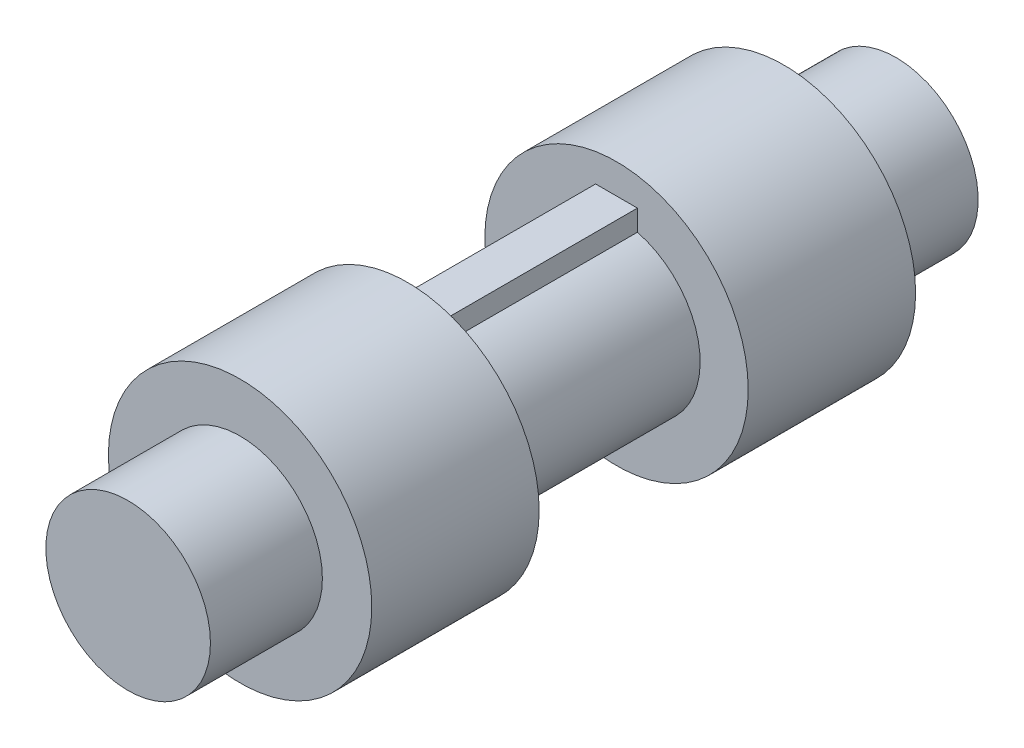
ISO-10303-21;
HEADER;
FILE_DESCRIPTION(('STEP AP214'),'2;1');
FILE_NAME('part.step','',(''),(''),'','','');
FILE_SCHEMA(('AUTOMOTIVE_DESIGN { 1 0 10303 214 1 1 1 1 }'));
ENDSEC;
DATA;
#1=APPLICATION_CONTEXT('core data for automotive mechanical design processes');
#2=APPLICATION_PROTOCOL_DEFINITION('international standard','automotive_design',2000,#1);
#3=PRODUCT_CONTEXT('',#1,'mechanical');
#4=PRODUCT('Part','Part','',(#3));
#5=PRODUCT_RELATED_PRODUCT_CATEGORY('part','',(#4));
#6=PRODUCT_DEFINITION_FORMATION('','',#4);
#7=PRODUCT_DEFINITION_CONTEXT('part definition',#1,'design');
#8=PRODUCT_DEFINITION('design','',#6,#7);
#9=PRODUCT_DEFINITION_SHAPE('','',#8);
#10=(LENGTH_UNIT() NAMED_UNIT(*) SI_UNIT(.MILLI.,.METRE.));
#11=(NAMED_UNIT(*) PLANE_ANGLE_UNIT() SI_UNIT($,.RADIAN.));
#12=(NAMED_UNIT(*) SI_UNIT($,.STERADIAN.) SOLID_ANGLE_UNIT());
#13=UNCERTAINTY_MEASURE_WITH_UNIT(LENGTH_MEASURE(1.E-05),#10,'distance_accuracy_value','');
#14=(GEOMETRIC_REPRESENTATION_CONTEXT(3) GLOBAL_UNCERTAINTY_ASSIGNED_CONTEXT((#13)) GLOBAL_UNIT_ASSIGNED_CONTEXT((#10,
#11,#12)) REPRESENTATION_CONTEXT('',''));
#15=CARTESIAN_POINT('',(0.,0.,0.));
#16=DIRECTION('',(0.,0.,1.));
#17=DIRECTION('',(1.,0.,0.));
#18=AXIS2_PLACEMENT_3D('',#15,#16,#17);
#19=CARTESIAN_POINT('',(0.,0.,-17.));
#20=DIRECTION('',(0.,0.,1.));
#21=DIRECTION('',(1.,0.,0.));
#22=AXIS2_PLACEMENT_3D('',#19,#20,#21);
#23=CYLINDRICAL_SURFACE('',#22,12.5);
#24=CARTESIAN_POINT('',(0.,0.,-17.));
#25=DIRECTION('',(0.,0.,1.));
#26=DIRECTION('',(1.,0.,0.));
#27=AXIS2_PLACEMENT_3D('',#24,#25,#26);
#28=CIRCLE('',#27,12.5);
#29=CARTESIAN_POINT('',(12.5,0.,-17.));
#30=VERTEX_POINT('',#29);
#31=EDGE_CURVE('E116',#30,#30,#28,.T.);
#32=ORIENTED_EDGE('',*,*,#31,.T.);
#33=EDGE_LOOP('',(#32));
#34=FACE_BOUND('',#33,.T.);
#35=CARTESIAN_POINT('',(0.,0.,0.));
#36=DIRECTION('',(0.,0.,1.));
#37=DIRECTION('',(1.,0.,0.));
#38=AXIS2_PLACEMENT_3D('',#35,#36,#37);
#39=CIRCLE('',#38,12.5);
#40=CARTESIAN_POINT('',(12.5,0.,0.));
#41=VERTEX_POINT('',#40);
#42=EDGE_CURVE('E36',#41,#41,#39,.T.);
#43=ORIENTED_EDGE('',*,*,#42,.F.);
#44=EDGE_LOOP('',(#43));
#45=FACE_BOUND('',#44,.T.);
#46=ADVANCED_FACE('F33',(#34,#45),#23,.T.);
#47=CARTESIAN_POINT('',(0.,0.,0.));
#48=DIRECTION('',(0.,0.,1.));
#49=DIRECTION('',(1.,0.,0.));
#50=AXIS2_PLACEMENT_3D('',#47,#48,#49);
#51=PLANE('',#50);
#52=ORIENTED_EDGE('',*,*,#42,.T.);
#53=EDGE_LOOP('',(#52));
#54=FACE_BOUND('',#53,.T.);
#55=ADVANCED_FACE('F124',(#54),#51,.T.);
#56=CARTESIAN_POINT('',(0.,0.,-42.425));
#57=DIRECTION('',(0.,0.,1.));
#58=DIRECTION('',(1.,0.,0.));
#59=AXIS2_PLACEMENT_3D('',#56,#57,#58);
#60=CYLINDRICAL_SURFACE('',#59,20.);
#61=CARTESIAN_POINT('',(0.,0.,-42.425));
#62=DIRECTION('',(0.,0.,-1.));
#63=DIRECTION('',(-1.,0.,0.));
#64=AXIS2_PLACEMENT_3D('',#61,#62,#63);
#65=CIRCLE('',#64,20.);
#66=CARTESIAN_POINT('',(20.,0.,-42.425));
#67=VERTEX_POINT('',#66);
#68=EDGE_CURVE('E113',#67,#67,#65,.T.);
#69=CARTESIAN_POINT('',(0.,0.,-17.));
#70=DIRECTION('',(0.,0.,-1.));
#71=DIRECTION('',(-1.,0.,0.));
#72=AXIS2_PLACEMENT_3D('',#69,#70,#71);
#73=CIRCLE('',#72,20.);
#74=CARTESIAN_POINT('',(20.,0.,-17.));
#75=VERTEX_POINT('',#74);
#76=EDGE_CURVE('E82',#75,#75,#73,.T.);
#77=CARTESIAN_POINT('',(20.,0.,-42.425));
#78=CARTESIAN_POINT('',(20.,0.,-42.16015625));
#79=CARTESIAN_POINT('',(20.,0.,-41.8953125));
#80=CARTESIAN_POINT('',(20.,0.,-41.365625));
#81=CARTESIAN_POINT('',(20.,0.,-41.10078125));
#82=CARTESIAN_POINT('',(20.,0.,-40.57109375));
#83=CARTESIAN_POINT('',(20.,0.,-40.30625));
#84=CARTESIAN_POINT('',(20.,0.,-39.7765625));
#85=CARTESIAN_POINT('',(20.,0.,-39.51171875));
#86=CARTESIAN_POINT('',(20.,0.,-38.98203125));
#87=CARTESIAN_POINT('',(20.,0.,-38.7171875));
#88=CARTESIAN_POINT('',(20.,0.,-38.1875));
#89=CARTESIAN_POINT('',(20.,0.,-37.92265625));
#90=CARTESIAN_POINT('',(20.,0.,-37.39296875));
#91=CARTESIAN_POINT('',(20.,0.,-37.128125));
#92=CARTESIAN_POINT('',(20.,0.,-36.5984375));
#93=CARTESIAN_POINT('',(20.,0.,-36.33359375));
#94=CARTESIAN_POINT('',(20.,0.,-35.80390625));
#95=CARTESIAN_POINT('',(20.,0.,-35.5390625));
#96=CARTESIAN_POINT('',(20.,0.,-35.009375));
#97=CARTESIAN_POINT('',(20.,0.,-34.74453125));
#98=CARTESIAN_POINT('',(20.,0.,-34.21484375));
#99=CARTESIAN_POINT('',(20.,0.,-33.95));
#100=CARTESIAN_POINT('',(20.,0.,-33.4203125));
#101=CARTESIAN_POINT('',(20.,0.,-33.15546875));
#102=CARTESIAN_POINT('',(20.,0.,-32.62578125));
#103=CARTESIAN_POINT('',(20.,0.,-32.3609375));
#104=CARTESIAN_POINT('',(20.,0.,-31.83125));
#105=CARTESIAN_POINT('',(20.,0.,-31.56640625));
#106=CARTESIAN_POINT('',(20.,0.,-31.03671875));
#107=CARTESIAN_POINT('',(20.,0.,-30.771875));
#108=CARTESIAN_POINT('',(20.,0.,-30.2421875));
#109=CARTESIAN_POINT('',(20.,0.,-29.97734375));
#110=CARTESIAN_POINT('',(20.,0.,-29.44765625));
#111=CARTESIAN_POINT('',(20.,0.,-29.1828125));
#112=CARTESIAN_POINT('',(20.,0.,-28.653125));
#113=CARTESIAN_POINT('',(20.,0.,-28.38828125));
#114=CARTESIAN_POINT('',(20.,0.,-27.85859375));
#115=CARTESIAN_POINT('',(20.,0.,-27.59375));
#116=CARTESIAN_POINT('',(20.,0.,-27.0640625));
#117=CARTESIAN_POINT('',(20.,0.,-26.79921875));
#118=CARTESIAN_POINT('',(20.,0.,-26.26953125));
#119=CARTESIAN_POINT('',(20.,0.,-26.0046875));
#120=CARTESIAN_POINT('',(20.,0.,-25.475));
#121=CARTESIAN_POINT('',(20.,0.,-25.21015625));
#122=CARTESIAN_POINT('',(20.,0.,-24.68046875));
#123=CARTESIAN_POINT('',(20.,0.,-24.415625));
#124=CARTESIAN_POINT('',(20.,0.,-23.8859375));
#125=CARTESIAN_POINT('',(20.,0.,-23.62109375));
#126=CARTESIAN_POINT('',(20.,0.,-23.09140625));
#127=CARTESIAN_POINT('',(20.,0.,-22.8265625));
#128=CARTESIAN_POINT('',(20.,0.,-22.296875));
#129=CARTESIAN_POINT('',(20.,0.,-22.03203125));
#130=CARTESIAN_POINT('',(20.,0.,-21.50234375));
#131=CARTESIAN_POINT('',(20.,0.,-21.2375));
#132=CARTESIAN_POINT('',(20.,0.,-20.7078125));
#133=CARTESIAN_POINT('',(20.,0.,-20.44296875));
#134=CARTESIAN_POINT('',(20.,0.,-19.91328125));
#135=CARTESIAN_POINT('',(20.,0.,-19.6484375));
#136=CARTESIAN_POINT('',(20.,0.,-19.11875));
#137=CARTESIAN_POINT('',(20.,0.,-18.85390625));
#138=CARTESIAN_POINT('',(20.,0.,-18.32421875));
#139=CARTESIAN_POINT('',(20.,0.,-18.059375));
#140=CARTESIAN_POINT('',(20.,0.,-17.5296875));
#141=CARTESIAN_POINT('',(20.,0.,-17.26484375));
#142=CARTESIAN_POINT('',(20.,0.,-17.));
#143=B_SPLINE_CURVE_WITH_KNOTS('',3,(#77,#78,#79,#80,#81,#82,#83,#84,#85,#86,#87,#88,#89,#90,
#91,#92,#93,#94,#95,#96,#97,#98,#99,#100,#101,#102,#103,#104,#105,#106,#107,#108,#109,#110,#111,
#112,#113,#114,#115,#116,#117,#118,#119,#120,#121,#122,#123,#124,#125,#126,#127,#128,#129,#130,
#131,#132,#133,#134,#135,#136,#137,#138,#139,#140,#141,#142),.UNSPECIFIED.,.F.,.F.,(4,2,2,2,2,2,
2,2,2,2,2,2,2,2,2,2,2,2,2,2,2,2,2,2,2,2,2,2,2,2,2,2,4),(0.,0.794531249999994,1.58906249999999,
2.38359375,3.178125,3.97265625,4.7671875,5.56171875,6.35625,7.15078125,7.9453125,8.73984375,
9.534375,10.32890625,11.1234375,11.91796875,12.7125,13.50703125,14.3015625,15.09609375,
15.890625,16.68515625,17.4796875,18.27421875,19.06875,19.86328125,20.6578125,21.45234375,
22.246875,23.04140625,23.8359375,24.63046875,25.425),.UNSPECIFIED.);
#144=EDGE_CURVE('BSEAM130',#67,#75,#143,.T.);
#145=ORIENTED_EDGE('',*,*,#68,.F.);
#146=ORIENTED_EDGE('',*,*,#76,.T.);
#147=ORIENTED_EDGE('',*,*,#144,.T.);
#148=ORIENTED_EDGE('',*,*,#144,.F.);
#149=EDGE_LOOP('',(#145,#147,#146,#148));
#150=FACE_BOUND('',#149,.T.);
#151=ADVANCED_FACE('F130',(#150),#60,.T.);
#152=CARTESIAN_POINT('',(0.,0.,-42.425));
#153=DIRECTION('',(0.,0.,-1.));
#154=DIRECTION('',(-1.,0.,0.));
#155=AXIS2_PLACEMENT_3D('',#152,#153,#154);
#156=PLANE('',#155);
#157=DIRECTION('',(0.,1.,0.));
#158=VECTOR('',#157,1.);
#159=CARTESIAN_POINT('',(3.175,15.4717221242085,-42.425));
#160=LINE('',#159,#158);
#161=CARTESIAN_POINT('',(3.175,12.2967221242085,-42.425));
#162=VERTEX_POINT('',#161);
#163=CARTESIAN_POINT('',(3.175,15.4717221242085,-42.425));
#164=VERTEX_POINT('',#163);
#165=EDGE_CURVE('E83',#162,#164,#160,.T.);
#166=ORIENTED_EDGE('',*,*,#165,.T.);
#167=DIRECTION('',(-1.,0.,0.));
#168=VECTOR('',#167,1.);
#169=CARTESIAN_POINT('',(-3.175,15.4717221242085,-42.425));
#170=LINE('',#169,#168);
#171=CARTESIAN_POINT('',(-3.175,15.4717221242085,-42.425));
#172=VERTEX_POINT('',#171);
#173=EDGE_CURVE('E183',#164,#172,#170,.T.);
#174=ORIENTED_EDGE('',*,*,#173,.T.);
#175=DIRECTION('',(0.,-1.,0.));
#176=VECTOR('',#175,1.);
#177=CARTESIAN_POINT('',(-3.175,15.4717221242085,-42.425));
#178=LINE('',#177,#176);
#179=CARTESIAN_POINT('',(-3.175,12.2967221242085,-42.425));
#180=VERTEX_POINT('',#179);
#181=EDGE_CURVE('E49',#172,#180,#178,.T.);
#182=ORIENTED_EDGE('',*,*,#181,.T.);
#183=CARTESIAN_POINT('',(0.,0.,-42.425));
#184=DIRECTION('',(0.,0.,-1.));
#185=DIRECTION('',(-1.,0.,0.));
#186=AXIS2_PLACEMENT_3D('',#183,#184,#185);
#187=CIRCLE('',#186,12.7);
#188=EDGE_CURVE('E42',#162,#180,#187,.T.);
#189=ORIENTED_EDGE('',*,*,#188,.F.);
#190=EDGE_LOOP('',(#166,#174,#182,#189));
#191=FACE_BOUND('',#190,.T.);
#192=ORIENTED_EDGE('',*,*,#68,.T.);
#193=EDGE_LOOP('',(#192));
#194=FACE_BOUND('',#193,.T.);
#195=ADVANCED_FACE('F134',(#191,#194),#156,.T.);
#196=CARTESIAN_POINT('',(0.,0.,-17.));
#197=DIRECTION('',(0.,0.,-1.));
#198=DIRECTION('',(-1.,0.,0.));
#199=AXIS2_PLACEMENT_3D('',#196,#197,#198);
#200=PLANE('',#199);
#201=ORIENTED_EDGE('',*,*,#31,.F.);
#202=EDGE_LOOP('',(#201));
#203=FACE_BOUND('',#202,.T.);
#204=ORIENTED_EDGE('',*,*,#76,.F.);
#205=EDGE_LOOP('',(#204));
#206=FACE_BOUND('',#205,.T.);
#207=ADVANCED_FACE('F138',(#203,#206),#200,.F.);
#208=CARTESIAN_POINT('',(0.,0.,-74.175));
#209=DIRECTION('',(0.,0.,1.));
#210=DIRECTION('',(1.,0.,0.));
#211=AXIS2_PLACEMENT_3D('',#208,#209,#210);
#212=CYLINDRICAL_SURFACE('',#211,12.7);
#213=CARTESIAN_POINT('',(0.,0.,-74.175));
#214=DIRECTION('',(0.,0.,-1.));
#215=DIRECTION('',(-1.,0.,0.));
#216=AXIS2_PLACEMENT_3D('',#213,#214,#215);
#217=CIRCLE('',#216,12.7);
#218=CARTESIAN_POINT('',(3.17500000000001,12.2967221242085,-74.175));
#219=VERTEX_POINT('',#218);
#220=CARTESIAN_POINT('',(-3.175,12.2967221242085,-74.175));
#221=VERTEX_POINT('',#220);
#222=EDGE_CURVE('E72',#219,#221,#217,.T.);
#223=ORIENTED_EDGE('',*,*,#222,.F.);
#224=DIRECTION('',(0.,0.,-1.));
#225=VECTOR('',#224,1.);
#226=CARTESIAN_POINT('',(3.175,12.2967221242085,-35.3254841714382));
#227=LINE('',#226,#225);
#228=EDGE_CURVE('E76',#162,#219,#227,.T.);
#229=ORIENTED_EDGE('',*,*,#228,.F.);
#230=ORIENTED_EDGE('',*,*,#188,.T.);
#231=DIRECTION('',(0.,0.,-1.));
#232=VECTOR('',#231,1.);
#233=CARTESIAN_POINT('',(-3.175,12.2967221242085,-35.3254841714382));
#234=LINE('',#233,#232);
#235=EDGE_CURVE('E78',#180,#221,#234,.T.);
#236=ORIENTED_EDGE('',*,*,#235,.T.);
#237=EDGE_LOOP('',(#223,#229,#230,#236));
#238=FACE_BOUND('',#237,.T.);
#239=ADVANCED_FACE('F74',(#238),#212,.T.);
#240=CARTESIAN_POINT('',(3.175,15.4717221242085,-35.3254841714382));
#241=DIRECTION('',(1.,0.,0.));
#242=DIRECTION('',(0.,1.,0.));
#243=AXIS2_PLACEMENT_3D('',#240,#241,#242);
#244=PLANE('',#243);
#245=ORIENTED_EDGE('',*,*,#165,.F.);
#246=ORIENTED_EDGE('',*,*,#228,.T.);
#247=DIRECTION('',(0.,-1.,0.));
#248=VECTOR('',#247,1.);
#249=CARTESIAN_POINT('',(3.175,15.4717221242085,-74.175));
#250=LINE('',#249,#248);
#251=CARTESIAN_POINT('',(3.175,15.4717221242085,-74.175));
#252=VERTEX_POINT('',#251);
#253=EDGE_CURVE('E89',#252,#219,#250,.T.);
#254=ORIENTED_EDGE('',*,*,#253,.F.);
#255=DIRECTION('',(0.,0.,-1.));
#256=VECTOR('',#255,1.);
#257=CARTESIAN_POINT('',(3.175,15.4717221242085,-35.3254841714382));
#258=LINE('',#257,#256);
#259=EDGE_CURVE('E107',#164,#252,#258,.T.);
#260=ORIENTED_EDGE('',*,*,#259,.F.);
#261=EDGE_LOOP('',(#245,#246,#254,#260));
#262=FACE_BOUND('',#261,.T.);
#263=ADVANCED_FACE('F87',(#262),#244,.T.);
#264=CARTESIAN_POINT('',(-3.175,15.4717221242085,-35.3254841714382));
#265=DIRECTION('',(0.,1.,0.));
#266=DIRECTION('',(0.,0.,1.));
#267=AXIS2_PLACEMENT_3D('',#264,#265,#266);
#268=PLANE('',#267);
#269=ORIENTED_EDGE('',*,*,#173,.F.);
#270=ORIENTED_EDGE('',*,*,#259,.T.);
#271=DIRECTION('',(1.,0.,0.));
#272=VECTOR('',#271,1.);
#273=CARTESIAN_POINT('',(-3.175,15.4717221242085,-74.175));
#274=LINE('',#273,#272);
#275=CARTESIAN_POINT('',(-3.175,15.4717221242085,-74.175));
#276=VERTEX_POINT('',#275);
#277=EDGE_CURVE('E92',#276,#252,#274,.T.);
#278=ORIENTED_EDGE('',*,*,#277,.F.);
#279=DIRECTION('',(0.,0.,-1.));
#280=VECTOR('',#279,1.);
#281=CARTESIAN_POINT('',(-3.175,15.4717221242085,-35.3254841714382));
#282=LINE('',#281,#280);
#283=EDGE_CURVE('E109',#172,#276,#282,.T.);
#284=ORIENTED_EDGE('',*,*,#283,.F.);
#285=EDGE_LOOP('',(#269,#270,#278,#284));
#286=FACE_BOUND('',#285,.T.);
#287=ADVANCED_FACE('F149',(#286),#268,.T.);
#288=CARTESIAN_POINT('',(-3.175,15.4717221242085,-35.3254841714382));
#289=DIRECTION('',(-1.,0.,0.));
#290=DIRECTION('',(0.,0.,1.));
#291=AXIS2_PLACEMENT_3D('',#288,#289,#290);
#292=PLANE('',#291);
#293=ORIENTED_EDGE('',*,*,#181,.F.);
#294=ORIENTED_EDGE('',*,*,#283,.T.);
#295=DIRECTION('',(0.,1.,0.));
#296=VECTOR('',#295,1.);
#297=CARTESIAN_POINT('',(-3.175,15.4717221242085,-74.175));
#298=LINE('',#297,#296);
#299=EDGE_CURVE('E96',#221,#276,#298,.T.);
#300=ORIENTED_EDGE('',*,*,#299,.F.);
#301=ORIENTED_EDGE('',*,*,#235,.F.);
#302=EDGE_LOOP('',(#293,#294,#300,#301));
#303=FACE_BOUND('',#302,.T.);
#304=ADVANCED_FACE('F150',(#303),#292,.T.);
#305=CARTESIAN_POINT('',(0.,0.,-74.175));
#306=DIRECTION('',(0.,0.,-1.));
#307=DIRECTION('',(-1.,0.,0.));
#308=AXIS2_PLACEMENT_3D('',#305,#306,#307);
#309=PLANE('',#308);
#310=CARTESIAN_POINT('',(0.,0.,-74.175));
#311=DIRECTION('',(0.,0.,-1.));
#312=DIRECTION('',(-1.,0.,0.));
#313=AXIS2_PLACEMENT_3D('',#310,#311,#312);
#314=CIRCLE('',#313,20.);
#315=CARTESIAN_POINT('',(20.,0.,-74.175));
#316=VERTEX_POINT('',#315);
#317=EDGE_CURVE('E101',#316,#316,#314,.T.);
#318=ORIENTED_EDGE('',*,*,#317,.F.);
#319=EDGE_LOOP('',(#318));
#320=FACE_BOUND('',#319,.T.);
#321=ORIENTED_EDGE('',*,*,#253,.T.);
#322=ORIENTED_EDGE('',*,*,#222,.T.);
#323=ORIENTED_EDGE('',*,*,#299,.T.);
#324=ORIENTED_EDGE('',*,*,#277,.T.);
#325=EDGE_LOOP('',(#321,#322,#323,#324));
#326=FACE_BOUND('',#325,.T.);
#327=ADVANCED_FACE('F94',(#320,#326),#309,.F.);
#328=CARTESIAN_POINT('',(0.,0.,-99.6));
#329=DIRECTION('',(0.,0.,1.));
#330=DIRECTION('',(1.,0.,0.));
#331=AXIS2_PLACEMENT_3D('',#328,#329,#330);
#332=CYLINDRICAL_SURFACE('',#331,20.);
#333=CARTESIAN_POINT('',(0.,0.,-99.6));
#334=DIRECTION('',(0.,0.,-1.));
#335=DIRECTION('',(-1.,0.,0.));
#336=AXIS2_PLACEMENT_3D('',#333,#334,#335);
#337=CIRCLE('',#336,20.);
#338=CARTESIAN_POINT('',(20.,0.,-99.6));
#339=VERTEX_POINT('',#338);
#340=EDGE_CURVE('E97',#339,#339,#337,.T.);
#341=CARTESIAN_POINT('',(20.,0.,-99.6));
#342=CARTESIAN_POINT('',(20.,0.,-99.33515625));
#343=CARTESIAN_POINT('',(20.,0.,-99.0703125));
#344=CARTESIAN_POINT('',(20.,0.,-98.540625));
#345=CARTESIAN_POINT('',(20.,0.,-98.27578125));
#346=CARTESIAN_POINT('',(20.,0.,-97.74609375));
#347=CARTESIAN_POINT('',(20.,0.,-97.48125));
#348=CARTESIAN_POINT('',(20.,0.,-96.9515625));
#349=CARTESIAN_POINT('',(20.,0.,-96.68671875));
#350=CARTESIAN_POINT('',(20.,0.,-96.15703125));
#351=CARTESIAN_POINT('',(20.,0.,-95.8921875));
#352=CARTESIAN_POINT('',(20.,0.,-95.3625));
#353=CARTESIAN_POINT('',(20.,0.,-95.09765625));
#354=CARTESIAN_POINT('',(20.,0.,-94.56796875));
#355=CARTESIAN_POINT('',(20.,0.,-94.303125));
#356=CARTESIAN_POINT('',(20.,0.,-93.7734375));
#357=CARTESIAN_POINT('',(20.,0.,-93.50859375));
#358=CARTESIAN_POINT('',(20.,0.,-92.97890625));
#359=CARTESIAN_POINT('',(20.,0.,-92.7140625));
#360=CARTESIAN_POINT('',(20.,0.,-92.184375));
#361=CARTESIAN_POINT('',(20.,0.,-91.91953125));
#362=CARTESIAN_POINT('',(20.,0.,-91.38984375));
#363=CARTESIAN_POINT('',(20.,0.,-91.125));
#364=CARTESIAN_POINT('',(20.,0.,-90.5953125));
#365=CARTESIAN_POINT('',(20.,0.,-90.33046875));
#366=CARTESIAN_POINT('',(20.,0.,-89.80078125));
#367=CARTESIAN_POINT('',(20.,0.,-89.5359375));
#368=CARTESIAN_POINT('',(20.,0.,-89.00625));
#369=CARTESIAN_POINT('',(20.,0.,-88.74140625));
#370=CARTESIAN_POINT('',(20.,0.,-88.21171875));
#371=CARTESIAN_POINT('',(20.,0.,-87.946875));
#372=CARTESIAN_POINT('',(20.,0.,-87.4171875));
#373=CARTESIAN_POINT('',(20.,0.,-87.15234375));
#374=CARTESIAN_POINT('',(20.,0.,-86.62265625));
#375=CARTESIAN_POINT('',(20.,0.,-86.3578125));
#376=CARTESIAN_POINT('',(20.,0.,-85.828125));
#377=CARTESIAN_POINT('',(20.,0.,-85.56328125));
#378=CARTESIAN_POINT('',(20.,0.,-85.03359375));
#379=CARTESIAN_POINT('',(20.,0.,-84.76875));
#380=CARTESIAN_POINT('',(20.,0.,-84.2390625));
#381=CARTESIAN_POINT('',(20.,0.,-83.97421875));
#382=CARTESIAN_POINT('',(20.,0.,-83.44453125));
#383=CARTESIAN_POINT('',(20.,0.,-83.1796875));
#384=CARTESIAN_POINT('',(20.,0.,-82.65));
#385=CARTESIAN_POINT('',(20.,0.,-82.38515625));
#386=CARTESIAN_POINT('',(20.,0.,-81.85546875));
#387=CARTESIAN_POINT('',(20.,0.,-81.590625));
#388=CARTESIAN_POINT('',(20.,0.,-81.0609375));
#389=CARTESIAN_POINT('',(20.,0.,-80.79609375));
#390=CARTESIAN_POINT('',(20.,0.,-80.26640625));
#391=CARTESIAN_POINT('',(20.,0.,-80.0015625));
#392=CARTESIAN_POINT('',(20.,0.,-79.471875));
#393=CARTESIAN_POINT('',(20.,0.,-79.20703125));
#394=CARTESIAN_POINT('',(20.,0.,-78.67734375));
#395=CARTESIAN_POINT('',(20.,0.,-78.4125));
#396=CARTESIAN_POINT('',(20.,0.,-77.8828125));
#397=CARTESIAN_POINT('',(20.,0.,-77.61796875));
#398=CARTESIAN_POINT('',(20.,0.,-77.08828125));
#399=CARTESIAN_POINT('',(20.,0.,-76.8234375));
#400=CARTESIAN_POINT('',(20.,0.,-76.29375));
#401=CARTESIAN_POINT('',(20.,0.,-76.02890625));
#402=CARTESIAN_POINT('',(20.,0.,-75.49921875));
#403=CARTESIAN_POINT('',(20.,0.,-75.234375));
#404=CARTESIAN_POINT('',(20.,0.,-74.7046875));
#405=CARTESIAN_POINT('',(20.,0.,-74.43984375));
#406=CARTESIAN_POINT('',(20.,0.,-74.175));
#407=B_SPLINE_CURVE_WITH_KNOTS('',3,(#341,#342,#343,#344,#345,#346,#347,#348,#349,#350,#351,
#352,#353,#354,#355,#356,#357,#358,#359,#360,#361,#362,#363,#364,#365,#366,#367,#368,#369,#370,
#371,#372,#373,#374,#375,#376,#377,#378,#379,#380,#381,#382,#383,#384,#385,#386,#387,#388,#389,
#390,#391,#392,#393,#394,#395,#396,#397,#398,#399,#400,#401,#402,#403,#404,#405,#406),
.UNSPECIFIED.,.F.,.F.,(4,2,2,2,2,2,2,2,2,2,2,2,2,2,2,2,2,2,2,2,2,2,2,2,2,2,2,2,2,2,2,2,4),(0.,
0.794531250000008,1.5890625,2.38359375000001,3.178125,3.97265625000001,4.76718750000001,
5.56171875000001,6.35625000000001,7.15078125,7.94531250000001,8.73984375,9.53437500000001,
10.32890625,11.1234375,11.91796875,12.7125,13.50703125,14.3015625,15.09609375,15.890625,
16.68515625,17.4796875,18.27421875,19.06875,19.86328125,20.6578125,21.45234375,22.246875,
23.04140625,23.8359375,24.63046875,25.425),.UNSPECIFIED.);
#408=EDGE_CURVE('BSEAM156',#339,#316,#407,.T.);
#409=ORIENTED_EDGE('',*,*,#340,.F.);
#410=ORIENTED_EDGE('',*,*,#317,.T.);
#411=ORIENTED_EDGE('',*,*,#408,.T.);
#412=ORIENTED_EDGE('',*,*,#408,.F.);
#413=EDGE_LOOP('',(#409,#411,#410,#412));
#414=FACE_BOUND('',#413,.T.);
#415=ADVANCED_FACE('F156',(#414),#332,.T.);
#416=CARTESIAN_POINT('',(0.,0.,-99.6));
#417=DIRECTION('',(0.,0.,-1.));
#418=DIRECTION('',(-1.,0.,0.));
#419=AXIS2_PLACEMENT_3D('',#416,#417,#418);
#420=PLANE('',#419);
#421=CARTESIAN_POINT('',(0.,0.,-99.6));
#422=DIRECTION('',(0.,0.,-1.));
#423=DIRECTION('',(-1.,0.,0.));
#424=AXIS2_PLACEMENT_3D('',#421,#422,#423);
#425=CIRCLE('',#424,12.5);
#426=CARTESIAN_POINT('',(-12.5,0.,-99.6));
#427=VERTEX_POINT('',#426);
#428=EDGE_CURVE('E11',#427,#427,#425,.T.);
#429=ORIENTED_EDGE('',*,*,#428,.F.);
#430=EDGE_LOOP('',(#429));
#431=FACE_BOUND('',#430,.T.);
#432=ORIENTED_EDGE('',*,*,#340,.T.);
#433=EDGE_LOOP('',(#432));
#434=FACE_BOUND('',#433,.T.);
#435=ADVANCED_FACE('F159',(#431,#434),#420,.T.);
#436=CARTESIAN_POINT('',(0.,0.,-116.6));
#437=DIRECTION('',(0.,0.,1.));
#438=DIRECTION('',(1.,0.,0.));
#439=AXIS2_PLACEMENT_3D('',#436,#437,#438);
#440=CYLINDRICAL_SURFACE('',#439,12.5);
#441=CARTESIAN_POINT('',(0.,0.,-116.6));
#442=DIRECTION('',(0.,0.,-1.));
#443=DIRECTION('',(-1.,0.,0.));
#444=AXIS2_PLACEMENT_3D('',#441,#442,#443);
#445=CIRCLE('',#444,12.5);
#446=CARTESIAN_POINT('',(-12.5,0.,-116.6));
#447=VERTEX_POINT('',#446);
#448=EDGE_CURVE('E178',#447,#447,#445,.T.);
#449=ORIENTED_EDGE('',*,*,#448,.F.);
#450=EDGE_LOOP('',(#449));
#451=FACE_BOUND('',#450,.T.);
#452=ORIENTED_EDGE('',*,*,#428,.T.);
#453=EDGE_LOOP('',(#452));
#454=FACE_BOUND('',#453,.T.);
#455=ADVANCED_FACE('F166',(#451,#454),#440,.T.);
#456=CARTESIAN_POINT('',(0.,0.,-116.6));
#457=DIRECTION('',(0.,0.,-1.));
#458=DIRECTION('',(-1.,0.,0.));
#459=AXIS2_PLACEMENT_3D('',#456,#457,#458);
#460=PLANE('',#459);
#461=ORIENTED_EDGE('',*,*,#448,.T.);
#462=EDGE_LOOP('',(#461));
#463=FACE_BOUND('',#462,.T.);
#464=ADVANCED_FACE('F170',(#463),#460,.T.);
#465=CLOSED_SHELL('',(#46,#55,#151,#195,#207,#239,#263,#287,#304,#327,#415,#435,#455,#464));
#466=MANIFOLD_SOLID_BREP('B2',#465);
#467=ADVANCED_BREP_SHAPE_REPRESENTATION('',(#18,#466),#14);
#468=SHAPE_DEFINITION_REPRESENTATION(#9,#467);
ENDSEC;
END-ISO-10303-21;
